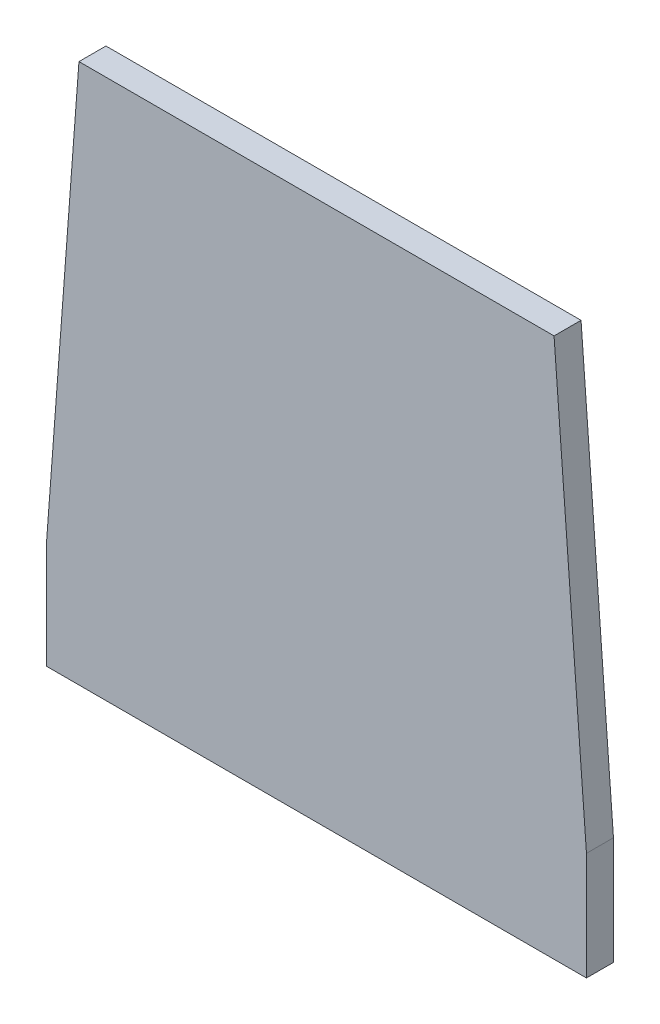
ISO-10303-21;
HEADER;
FILE_DESCRIPTION(('STEP AP214'),'2;1');
FILE_NAME('part.step','',(''),(''),'','','');
FILE_SCHEMA(('AUTOMOTIVE_DESIGN { 1 0 10303 214 1 1 1 1 }'));
ENDSEC;
DATA;
#1=APPLICATION_CONTEXT('core data for automotive mechanical design processes');
#2=APPLICATION_PROTOCOL_DEFINITION('international standard','automotive_design',2000,#1);
#3=PRODUCT_CONTEXT('',#1,'mechanical');
#4=PRODUCT('Part','Part','',(#3));
#5=PRODUCT_RELATED_PRODUCT_CATEGORY('part','',(#4));
#6=PRODUCT_DEFINITION_FORMATION('','',#4);
#7=PRODUCT_DEFINITION_CONTEXT('part definition',#1,'design');
#8=PRODUCT_DEFINITION('design','',#6,#7);
#9=PRODUCT_DEFINITION_SHAPE('','',#8);
#10=(LENGTH_UNIT() NAMED_UNIT(*) SI_UNIT(.MILLI.,.METRE.));
#11=(NAMED_UNIT(*) PLANE_ANGLE_UNIT() SI_UNIT($,.RADIAN.));
#12=(NAMED_UNIT(*) SI_UNIT($,.STERADIAN.) SOLID_ANGLE_UNIT());
#13=UNCERTAINTY_MEASURE_WITH_UNIT(LENGTH_MEASURE(1.E-05),#10,'distance_accuracy_value','');
#14=(GEOMETRIC_REPRESENTATION_CONTEXT(3) GLOBAL_UNCERTAINTY_ASSIGNED_CONTEXT((#13)) GLOBAL_UNIT_ASSIGNED_CONTEXT((#10,
#11,#12)) REPRESENTATION_CONTEXT('',''));
#15=CARTESIAN_POINT('',(0.,0.,0.));
#16=DIRECTION('',(0.,0.,1.));
#17=DIRECTION('',(1.,0.,0.));
#18=AXIS2_PLACEMENT_3D('',#15,#16,#17);
#19=CARTESIAN_POINT('',(57.4617775015538,4.30963331261663,6.35));
#20=DIRECTION('',(0.997199309888456,0.074789948241636,0.));
#21=DIRECTION('',(-0.074789948241636,0.997199309888456,0.));
#22=AXIS2_PLACEMENT_3D('',#19,#20,#21);
#23=PLANE('',#22);
#24=DIRECTION('',(0.074789948241636,-0.997199309888456,0.));
#25=VECTOR('',#24,1.);
#26=CARTESIAN_POINT('',(57.4617775015538,4.30963331261663,0.));
#27=LINE('',#26,#25);
#28=CARTESIAN_POINT('',(55.88,25.4,0.));
#29=VERTEX_POINT('',#28);
#30=CARTESIAN_POINT('',(63.5000000000002,-76.2000000000004,0.));
#31=VERTEX_POINT('',#30);
#32=EDGE_CURVE('E116',#29,#31,#27,.T.);
#33=ORIENTED_EDGE('',*,*,#32,.F.);
#34=DIRECTION('',(0.,0.,-1.));
#35=VECTOR('',#34,1.);
#36=CARTESIAN_POINT('',(55.88,25.4,6.35));
#37=LINE('',#36,#35);
#38=CARTESIAN_POINT('',(55.88,25.4,6.35));
#39=VERTEX_POINT('',#38);
#40=EDGE_CURVE('E11',#39,#29,#37,.T.);
#41=ORIENTED_EDGE('',*,*,#40,.F.);
#42=DIRECTION('',(0.074789948241636,-0.997199309888456,0.));
#43=VECTOR('',#42,1.);
#44=CARTESIAN_POINT('',(57.4617775015538,4.30963331261663,6.35));
#45=LINE('',#44,#43);
#46=CARTESIAN_POINT('',(63.5000000000002,-76.2000000000004,6.35));
#47=VERTEX_POINT('',#46);
#48=EDGE_CURVE('E131',#39,#47,#45,.T.);
#49=ORIENTED_EDGE('',*,*,#48,.T.);
#50=DIRECTION('',(0.,0.,-1.));
#51=VECTOR('',#50,1.);
#52=CARTESIAN_POINT('',(63.5000000000002,-76.2000000000004,6.35));
#53=LINE('',#52,#51);
#54=EDGE_CURVE('E51',#47,#31,#53,.T.);
#55=ORIENTED_EDGE('',*,*,#54,.T.);
#56=EDGE_LOOP('',(#33,#41,#49,#55));
#57=FACE_BOUND('',#56,.T.);
#58=ADVANCED_FACE('F35',(#57),#23,.T.);
#59=CARTESIAN_POINT('',(0.,25.4,6.35));
#60=DIRECTION('',(0.,1.,0.));
#61=DIRECTION('',(-1.,0.,0.));
#62=AXIS2_PLACEMENT_3D('',#59,#60,#61);
#63=PLANE('',#62);
#64=DIRECTION('',(1.,0.,0.));
#65=VECTOR('',#64,1.);
#66=CARTESIAN_POINT('',(0.,25.4,0.));
#67=LINE('',#66,#65);
#68=CARTESIAN_POINT('',(-55.88,25.4,0.));
#69=VERTEX_POINT('',#68);
#70=EDGE_CURVE('E118',#69,#29,#67,.T.);
#71=ORIENTED_EDGE('',*,*,#70,.F.);
#72=DIRECTION('',(0.,0.,-1.));
#73=VECTOR('',#72,1.);
#74=CARTESIAN_POINT('',(-55.88,25.4,6.35));
#75=LINE('',#74,#73);
#76=CARTESIAN_POINT('',(-55.88,25.4,6.35));
#77=VERTEX_POINT('',#76);
#78=EDGE_CURVE('E43',#77,#69,#75,.T.);
#79=ORIENTED_EDGE('',*,*,#78,.F.);
#80=DIRECTION('',(1.,0.,0.));
#81=VECTOR('',#80,1.);
#82=CARTESIAN_POINT('',(0.,25.4,6.35));
#83=LINE('',#82,#81);
#84=EDGE_CURVE('E250',#77,#39,#83,.T.);
#85=ORIENTED_EDGE('',*,*,#84,.T.);
#86=ORIENTED_EDGE('',*,*,#40,.T.);
#87=EDGE_LOOP('',(#71,#79,#85,#86));
#88=FACE_BOUND('',#87,.T.);
#89=ADVANCED_FACE('F140',(#88),#63,.T.);
#90=CARTESIAN_POINT('',(-57.4617775015538,4.30963331261638,6.35));
#91=DIRECTION('',(-0.997199309888457,0.0747899482416317,0.));
#92=DIRECTION('',(-0.0747899482416317,-0.997199309888457,0.));
#93=AXIS2_PLACEMENT_3D('',#90,#91,#92);
#94=PLANE('',#93);
#95=DIRECTION('',(0.0747899482416317,0.997199309888457,0.));
#96=VECTOR('',#95,1.);
#97=CARTESIAN_POINT('',(-57.4617775015538,4.30963331261638,0.));
#98=LINE('',#97,#96);
#99=CARTESIAN_POINT('',(-63.4999999999998,-76.2000000000004,0.));
#100=VERTEX_POINT('',#99);
#101=EDGE_CURVE('E122',#100,#69,#98,.T.);
#102=ORIENTED_EDGE('',*,*,#101,.F.);
#103=DIRECTION('',(0.,0.,-1.));
#104=VECTOR('',#103,1.);
#105=CARTESIAN_POINT('',(-63.4999999999998,-76.2000000000004,6.35));
#106=LINE('',#105,#104);
#107=CARTESIAN_POINT('',(-63.4999999999998,-76.2000000000004,6.35));
#108=VERTEX_POINT('',#107);
#109=EDGE_CURVE('E98',#108,#100,#106,.T.);
#110=ORIENTED_EDGE('',*,*,#109,.F.);
#111=DIRECTION('',(0.0747899482416317,0.997199309888457,0.));
#112=VECTOR('',#111,1.);
#113=CARTESIAN_POINT('',(-57.4617775015538,4.30963331261638,6.35));
#114=LINE('',#113,#112);
#115=EDGE_CURVE('E108',#108,#77,#114,.T.);
#116=ORIENTED_EDGE('',*,*,#115,.T.);
#117=ORIENTED_EDGE('',*,*,#78,.T.);
#118=EDGE_LOOP('',(#102,#110,#116,#117));
#119=FACE_BOUND('',#118,.T.);
#120=ADVANCED_FACE('F137',(#119),#94,.T.);
#121=CARTESIAN_POINT('',(-63.4999999999992,5.55111512312582E-13,6.35));
#122=DIRECTION('',(-1.,0.,0.));
#123=DIRECTION('',(0.,-1.,0.));
#124=AXIS2_PLACEMENT_3D('',#121,#122,#123);
#125=PLANE('',#124);
#126=DIRECTION('',(0.,1.,0.));
#127=VECTOR('',#126,1.);
#128=CARTESIAN_POINT('',(-63.4999999999992,5.55111512312582E-13,0.));
#129=LINE('',#128,#127);
#130=CARTESIAN_POINT('',(-63.5,-101.6,0.));
#131=VERTEX_POINT('',#130);
#132=EDGE_CURVE('E94',#131,#100,#129,.T.);
#133=ORIENTED_EDGE('',*,*,#132,.F.);
#134=DIRECTION('',(0.,0.,-1.));
#135=VECTOR('',#134,1.);
#136=CARTESIAN_POINT('',(-63.5,-101.6,6.35));
#137=LINE('',#136,#135);
#138=CARTESIAN_POINT('',(-63.5,-101.6,6.35));
#139=VERTEX_POINT('',#138);
#140=EDGE_CURVE('E89',#139,#131,#137,.T.);
#141=ORIENTED_EDGE('',*,*,#140,.F.);
#142=DIRECTION('',(0.,1.,0.));
#143=VECTOR('',#142,1.);
#144=CARTESIAN_POINT('',(-63.4999999999992,5.55111512312582E-13,6.35));
#145=LINE('',#144,#143);
#146=EDGE_CURVE('E92',#139,#108,#145,.T.);
#147=ORIENTED_EDGE('',*,*,#146,.T.);
#148=ORIENTED_EDGE('',*,*,#109,.T.);
#149=EDGE_LOOP('',(#133,#141,#147,#148));
#150=FACE_BOUND('',#149,.T.);
#151=ADVANCED_FACE('F91',(#150),#125,.T.);
#152=CARTESIAN_POINT('',(0.,-101.6,6.35));
#153=DIRECTION('',(0.,-1.,0.));
#154=DIRECTION('',(0.,0.,-1.));
#155=AXIS2_PLACEMENT_3D('',#152,#153,#154);
#156=PLANE('',#155);
#157=DIRECTION('',(-1.,0.,0.));
#158=VECTOR('',#157,1.);
#159=CARTESIAN_POINT('',(0.,-101.6,0.));
#160=LINE('',#159,#158);
#161=CARTESIAN_POINT('',(63.4999999999999,-101.6,0.));
#162=VERTEX_POINT('',#161);
#163=EDGE_CURVE('E126',#162,#131,#160,.T.);
#164=ORIENTED_EDGE('',*,*,#163,.F.);
#165=DIRECTION('',(0.,0.,-1.));
#166=VECTOR('',#165,1.);
#167=CARTESIAN_POINT('',(63.4999999999999,-101.6,6.35));
#168=LINE('',#167,#166);
#169=CARTESIAN_POINT('',(63.4999999999999,-101.6,6.35));
#170=VERTEX_POINT('',#169);
#171=EDGE_CURVE('E70',#170,#162,#168,.T.);
#172=ORIENTED_EDGE('',*,*,#171,.F.);
#173=DIRECTION('',(-1.,0.,0.));
#174=VECTOR('',#173,1.);
#175=CARTESIAN_POINT('',(0.,-101.6,6.35));
#176=LINE('',#175,#174);
#177=EDGE_CURVE('E105',#170,#139,#176,.T.);
#178=ORIENTED_EDGE('',*,*,#177,.T.);
#179=ORIENTED_EDGE('',*,*,#140,.T.);
#180=EDGE_LOOP('',(#164,#172,#178,#179));
#181=FACE_BOUND('',#180,.T.);
#182=ADVANCED_FACE('F110',(#181),#156,.T.);
#183=CARTESIAN_POINT('',(63.500000000001,-6.93889390390748E-13,6.35));
#184=DIRECTION('',(1.,0.,0.));
#185=DIRECTION('',(0.,1.,0.));
#186=AXIS2_PLACEMENT_3D('',#183,#184,#185);
#187=PLANE('',#186);
#188=DIRECTION('',(0.,-1.,0.));
#189=VECTOR('',#188,1.);
#190=CARTESIAN_POINT('',(63.500000000001,-6.93889390390748E-13,0.));
#191=LINE('',#190,#189);
#192=EDGE_CURVE('E128',#31,#162,#191,.T.);
#193=ORIENTED_EDGE('',*,*,#192,.F.);
#194=ORIENTED_EDGE('',*,*,#54,.F.);
#195=DIRECTION('',(0.,-1.,0.));
#196=VECTOR('',#195,1.);
#197=CARTESIAN_POINT('',(63.500000000001,-6.93889390390748E-13,6.35));
#198=LINE('',#197,#196);
#199=EDGE_CURVE('E111',#47,#170,#198,.T.);
#200=ORIENTED_EDGE('',*,*,#199,.T.);
#201=ORIENTED_EDGE('',*,*,#171,.T.);
#202=EDGE_LOOP('',(#193,#194,#200,#201));
#203=FACE_BOUND('',#202,.T.);
#204=ADVANCED_FACE('F143',(#203),#187,.T.);
#205=CARTESIAN_POINT('',(0.,0.,6.35));
#206=DIRECTION('',(0.,0.,1.));
#207=DIRECTION('',(1.,0.,0.));
#208=AXIS2_PLACEMENT_3D('',#205,#206,#207);
#209=PLANE('',#208);
#210=ORIENTED_EDGE('',*,*,#48,.F.);
#211=ORIENTED_EDGE('',*,*,#84,.F.);
#212=ORIENTED_EDGE('',*,*,#115,.F.);
#213=ORIENTED_EDGE('',*,*,#146,.F.);
#214=ORIENTED_EDGE('',*,*,#177,.F.);
#215=ORIENTED_EDGE('',*,*,#199,.F.);
#216=EDGE_LOOP('',(#210,#211,#212,#213,#214,#215));
#217=FACE_BOUND('',#216,.T.);
#218=ADVANCED_FACE('F103',(#217),#209,.T.);
#219=CARTESIAN_POINT('',(0.,0.,0.));
#220=DIRECTION('',(0.,0.,1.));
#221=DIRECTION('',(1.,0.,0.));
#222=AXIS2_PLACEMENT_3D('',#219,#220,#221);
#223=PLANE('',#222);
#224=CARTESIAN_POINT('',(25.4,-88.9,0.));
#225=DIRECTION('',(0.,0.,1.));
#226=DIRECTION('',(1.,0.,0.));
#227=AXIS2_PLACEMENT_3D('',#224,#225,#226);
#228=CIRCLE('',#227,3.175);
#229=CARTESIAN_POINT('',(28.575,-88.9,0.));
#230=VERTEX_POINT('',#229);
#231=EDGE_CURVE('E239',#230,#230,#228,.T.);
#232=ORIENTED_EDGE('',*,*,#231,.T.);
#233=EDGE_LOOP('',(#232));
#234=FACE_BOUND('',#233,.T.);
#235=CARTESIAN_POINT('',(-25.4,-88.9,0.));
#236=DIRECTION('',(0.,0.,1.));
#237=DIRECTION('',(1.,0.,0.));
#238=AXIS2_PLACEMENT_3D('',#235,#236,#237);
#239=CIRCLE('',#238,3.175);
#240=CARTESIAN_POINT('',(-22.225,-88.9,0.));
#241=VERTEX_POINT('',#240);
#242=EDGE_CURVE('E119',#241,#241,#239,.T.);
#243=ORIENTED_EDGE('',*,*,#242,.T.);
#244=EDGE_LOOP('',(#243));
#245=FACE_BOUND('',#244,.T.);
#246=ORIENTED_EDGE('',*,*,#32,.T.);
#247=ORIENTED_EDGE('',*,*,#192,.T.);
#248=ORIENTED_EDGE('',*,*,#163,.T.);
#249=ORIENTED_EDGE('',*,*,#132,.T.);
#250=ORIENTED_EDGE('',*,*,#101,.T.);
#251=ORIENTED_EDGE('',*,*,#70,.T.);
#252=EDGE_LOOP('',(#246,#247,#248,#249,#250,#251));
#253=FACE_BOUND('',#252,.T.);
#254=ADVANCED_FACE('F142',(#234,#245,#253),#223,.F.);
#255=CARTESIAN_POINT('',(-25.4,-88.9,0.));
#256=DIRECTION('',(0.,0.,1.));
#257=DIRECTION('',(1.,0.,0.));
#258=AXIS2_PLACEMENT_3D('',#255,#256,#257);
#259=CYLINDRICAL_SURFACE('',#258,3.175);
#260=ORIENTED_EDGE('',*,*,#242,.F.);
#261=EDGE_LOOP('',(#260));
#262=FACE_BOUND('',#261,.T.);
#263=CARTESIAN_POINT('',(-25.4,-88.9,3.175));
#264=DIRECTION('',(0.,0.,1.));
#265=DIRECTION('',(1.,0.,0.));
#266=AXIS2_PLACEMENT_3D('',#263,#264,#265);
#267=CIRCLE('',#266,3.175);
#268=CARTESIAN_POINT('',(-22.225,-88.9,3.175));
#269=VERTEX_POINT('',#268);
#270=EDGE_CURVE('E242',#269,#269,#267,.T.);
#271=ORIENTED_EDGE('',*,*,#270,.T.);
#272=EDGE_LOOP('',(#271));
#273=FACE_BOUND('',#272,.T.);
#274=ADVANCED_FACE('F192',(#262,#273),#259,.F.);
#275=CARTESIAN_POINT('',(-25.4,-88.9,3.175));
#276=DIRECTION('',(0.,0.,1.));
#277=DIRECTION('',(1.,0.,0.));
#278=AXIS2_PLACEMENT_3D('',#275,#276,#277);
#279=PLANE('',#278);
#280=ORIENTED_EDGE('',*,*,#270,.F.);
#281=EDGE_LOOP('',(#280));
#282=FACE_BOUND('',#281,.T.);
#283=ADVANCED_FACE('F201',(#282),#279,.F.);
#284=CARTESIAN_POINT('',(25.4,-88.9,0.));
#285=DIRECTION('',(0.,0.,1.));
#286=DIRECTION('',(1.,0.,0.));
#287=AXIS2_PLACEMENT_3D('',#284,#285,#286);
#288=CYLINDRICAL_SURFACE('',#287,3.175);
#289=ORIENTED_EDGE('',*,*,#231,.F.);
#290=EDGE_LOOP('',(#289));
#291=FACE_BOUND('',#290,.T.);
#292=CARTESIAN_POINT('',(25.4,-88.9,3.175));
#293=DIRECTION('',(0.,0.,1.));
#294=DIRECTION('',(1.,0.,0.));
#295=AXIS2_PLACEMENT_3D('',#292,#293,#294);
#296=CIRCLE('',#295,3.175);
#297=CARTESIAN_POINT('',(28.575,-88.9,3.175));
#298=VERTEX_POINT('',#297);
#299=EDGE_CURVE('E237',#298,#298,#296,.T.);
#300=ORIENTED_EDGE('',*,*,#299,.T.);
#301=EDGE_LOOP('',(#300));
#302=FACE_BOUND('',#301,.T.);
#303=ADVANCED_FACE('F211',(#291,#302),#288,.F.);
#304=CARTESIAN_POINT('',(25.4,-88.9,3.175));
#305=DIRECTION('',(0.,0.,1.));
#306=DIRECTION('',(1.,0.,0.));
#307=AXIS2_PLACEMENT_3D('',#304,#305,#306);
#308=PLANE('',#307);
#309=ORIENTED_EDGE('',*,*,#299,.F.);
#310=EDGE_LOOP('',(#309));
#311=FACE_BOUND('',#310,.T.);
#312=ADVANCED_FACE('F221',(#311),#308,.F.);
#313=CLOSED_SHELL('',(#58,#89,#120,#151,#182,#204,#218,#254,#274,#283,#303,#312));
#314=MANIFOLD_SOLID_BREP('B2',#313);
#315=ADVANCED_BREP_SHAPE_REPRESENTATION('',(#18,#314),#14);
#316=SHAPE_DEFINITION_REPRESENTATION(#9,#315);
ENDSEC;
END-ISO-10303-21;
